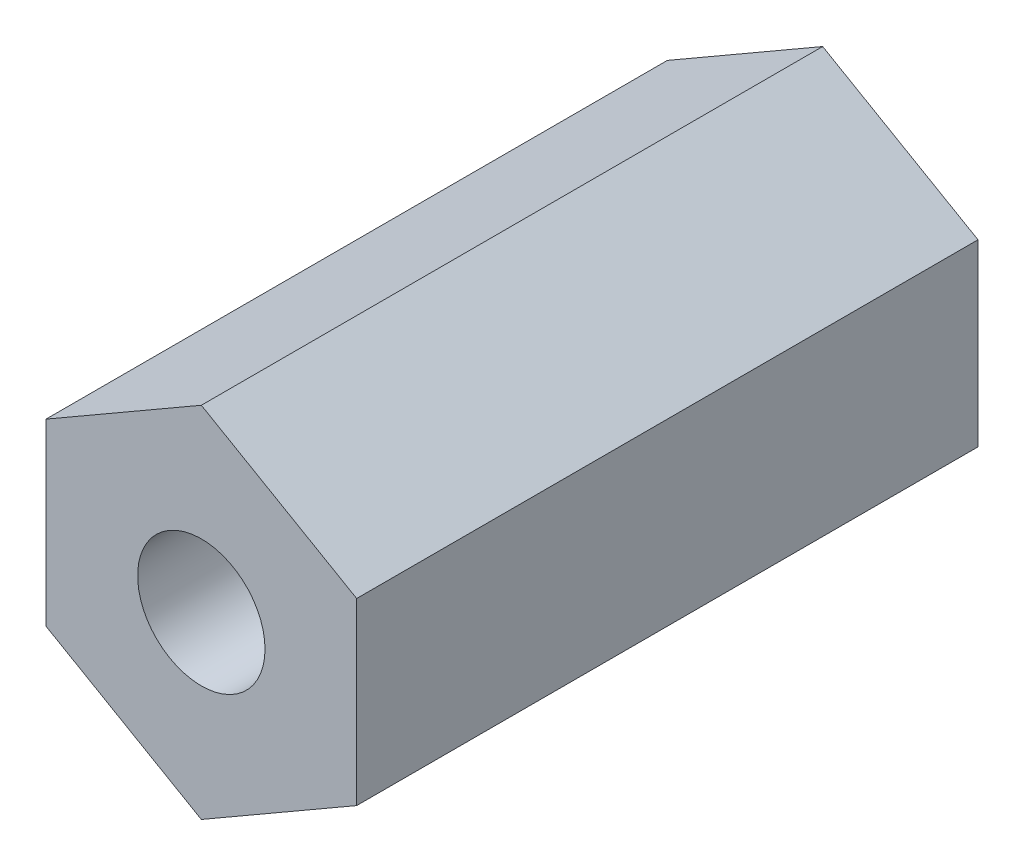
ISO-10303-21;
HEADER;
FILE_DESCRIPTION(('STEP AP214'),'2;1');
FILE_NAME('part.step','',(''),(''),'','','');
FILE_SCHEMA(('AUTOMOTIVE_DESIGN { 1 0 10303 214 1 1 1 1 }'));
ENDSEC;
DATA;
#1=APPLICATION_CONTEXT('core data for automotive mechanical design processes');
#2=APPLICATION_PROTOCOL_DEFINITION('international standard','automotive_design',2000,#1);
#3=PRODUCT_CONTEXT('',#1,'mechanical');
#4=PRODUCT('Part','Part','',(#3));
#5=PRODUCT_RELATED_PRODUCT_CATEGORY('part','',(#4));
#6=PRODUCT_DEFINITION_FORMATION('','',#4);
#7=PRODUCT_DEFINITION_CONTEXT('part definition',#1,'design');
#8=PRODUCT_DEFINITION('design','',#6,#7);
#9=PRODUCT_DEFINITION_SHAPE('','',#8);
#10=(LENGTH_UNIT() NAMED_UNIT(*) SI_UNIT(.MILLI.,.METRE.));
#11=(NAMED_UNIT(*) PLANE_ANGLE_UNIT() SI_UNIT($,.RADIAN.));
#12=(NAMED_UNIT(*) SI_UNIT($,.STERADIAN.) SOLID_ANGLE_UNIT());
#13=UNCERTAINTY_MEASURE_WITH_UNIT(LENGTH_MEASURE(1.E-05),#10,'distance_accuracy_value','');
#14=(GEOMETRIC_REPRESENTATION_CONTEXT(3) GLOBAL_UNCERTAINTY_ASSIGNED_CONTEXT((#13)) GLOBAL_UNIT_ASSIGNED_CONTEXT((#10,
#11,#12)) REPRESENTATION_CONTEXT('',''));
#15=CARTESIAN_POINT('',(0.,0.,0.));
#16=DIRECTION('',(0.,0.,1.));
#17=DIRECTION('',(1.,0.,0.));
#18=AXIS2_PLACEMENT_3D('',#15,#16,#17);
#19=CARTESIAN_POINT('',(-2.49999999999998,-1.44337567297409,10.));
#20=DIRECTION('',(0.499999999999995,0.866025403784442,0.));
#21=DIRECTION('',(-0.866025403784442,0.499999999999995,0.));
#22=AXIS2_PLACEMENT_3D('',#19,#20,#21);
#23=PLANE('',#22);
#24=DIRECTION('',(0.866025403784441,-0.499999999999995,0.));
#25=VECTOR('',#24,1.);
#26=CARTESIAN_POINT('',(-2.49999999999998,-1.44337567297409,0.));
#27=LINE('',#26,#25);
#28=CARTESIAN_POINT('',(-2.49999999999998,-1.44337567297409,0.));
#29=VERTEX_POINT('',#28);
#30=CARTESIAN_POINT('',(0.,-2.88675134594813,0.));
#31=VERTEX_POINT('',#30);
#32=EDGE_CURVE('E122',#29,#31,#27,.T.);
#33=ORIENTED_EDGE('',*,*,#32,.T.);
#34=DIRECTION('',(0.,0.,-1.));
#35=VECTOR('',#34,1.);
#36=CARTESIAN_POINT('',(0.,-2.88675134594813,10.));
#37=LINE('',#36,#35);
#38=CARTESIAN_POINT('',(0.,-2.88675134594813,10.));
#39=VERTEX_POINT('',#38);
#40=EDGE_CURVE('E11',#39,#31,#37,.T.);
#41=ORIENTED_EDGE('',*,*,#40,.F.);
#42=DIRECTION('',(0.866025403784441,-0.499999999999995,0.));
#43=VECTOR('',#42,1.);
#44=CARTESIAN_POINT('',(-2.49999999999998,-1.44337567297409,10.));
#45=LINE('',#44,#43);
#46=CARTESIAN_POINT('',(-2.49999999999998,-1.44337567297409,10.));
#47=VERTEX_POINT('',#46);
#48=EDGE_CURVE('E132',#47,#39,#45,.T.);
#49=ORIENTED_EDGE('',*,*,#48,.F.);
#50=DIRECTION('',(0.,0.,-1.));
#51=VECTOR('',#50,1.);
#52=CARTESIAN_POINT('',(-2.49999999999998,-1.44337567297409,10.));
#53=LINE('',#52,#51);
#54=EDGE_CURVE('E117',#47,#29,#53,.T.);
#55=ORIENTED_EDGE('',*,*,#54,.T.);
#56=EDGE_LOOP('',(#33,#41,#49,#55));
#57=FACE_BOUND('',#56,.T.);
#58=ADVANCED_FACE('F39',(#57),#23,.F.);
#59=CARTESIAN_POINT('',(0.,-2.88675134594813,10.));
#60=DIRECTION('',(-0.500000000000001,0.866025403784438,0.));
#61=DIRECTION('',(-0.866025403784438,-0.500000000000001,0.));
#62=AXIS2_PLACEMENT_3D('',#59,#60,#61);
#63=PLANE('',#62);
#64=DIRECTION('',(0.866025403784438,0.500000000000001,0.));
#65=VECTOR('',#64,1.);
#66=CARTESIAN_POINT('',(0.,-2.88675134594813,0.));
#67=LINE('',#66,#65);
#68=CARTESIAN_POINT('',(2.5,-1.44337567297406,0.));
#69=VERTEX_POINT('',#68);
#70=EDGE_CURVE('E127',#31,#69,#67,.T.);
#71=ORIENTED_EDGE('',*,*,#70,.T.);
#72=DIRECTION('',(0.,0.,-1.));
#73=VECTOR('',#72,1.);
#74=CARTESIAN_POINT('',(2.5,-1.44337567297406,10.));
#75=LINE('',#74,#73);
#76=CARTESIAN_POINT('',(2.5,-1.44337567297406,10.));
#77=VERTEX_POINT('',#76);
#78=EDGE_CURVE('E50',#77,#69,#75,.T.);
#79=ORIENTED_EDGE('',*,*,#78,.F.);
#80=DIRECTION('',(0.866025403784438,0.500000000000001,0.));
#81=VECTOR('',#80,1.);
#82=CARTESIAN_POINT('',(0.,-2.88675134594813,10.));
#83=LINE('',#82,#81);
#84=EDGE_CURVE('E95',#39,#77,#83,.T.);
#85=ORIENTED_EDGE('',*,*,#84,.F.);
#86=ORIENTED_EDGE('',*,*,#40,.T.);
#87=EDGE_LOOP('',(#71,#79,#85,#86));
#88=FACE_BOUND('',#87,.T.);
#89=ADVANCED_FACE('F157',(#88),#63,.F.);
#90=CARTESIAN_POINT('',(2.5,-1.44337567297406,10.));
#91=DIRECTION('',(-1.,0.,0.));
#92=DIRECTION('',(0.,-1.,0.));
#93=AXIS2_PLACEMENT_3D('',#90,#91,#92);
#94=PLANE('',#93);
#95=DIRECTION('',(0.,1.,0.));
#96=VECTOR('',#95,1.);
#97=CARTESIAN_POINT('',(2.5,-1.44337567297406,0.));
#98=LINE('',#97,#96);
#99=CARTESIAN_POINT('',(2.49999999999999,1.44337567297408,0.));
#100=VERTEX_POINT('',#99);
#101=EDGE_CURVE('E129',#69,#100,#98,.T.);
#102=ORIENTED_EDGE('',*,*,#101,.T.);
#103=DIRECTION('',(0.,0.,-1.));
#104=VECTOR('',#103,1.);
#105=CARTESIAN_POINT('',(2.49999999999999,1.44337567297408,10.));
#106=LINE('',#105,#104);
#107=CARTESIAN_POINT('',(2.49999999999999,1.44337567297408,10.));
#108=VERTEX_POINT('',#107);
#109=EDGE_CURVE('E111',#108,#100,#106,.T.);
#110=ORIENTED_EDGE('',*,*,#109,.F.);
#111=DIRECTION('',(0.,1.,0.));
#112=VECTOR('',#111,1.);
#113=CARTESIAN_POINT('',(2.5,-1.44337567297406,10.));
#114=LINE('',#113,#112);
#115=EDGE_CURVE('E104',#77,#108,#114,.T.);
#116=ORIENTED_EDGE('',*,*,#115,.F.);
#117=ORIENTED_EDGE('',*,*,#78,.T.);
#118=EDGE_LOOP('',(#102,#110,#116,#117));
#119=FACE_BOUND('',#118,.T.);
#120=ADVANCED_FACE('F139',(#119),#94,.F.);
#121=CARTESIAN_POINT('',(2.49999999999999,1.44337567297408,10.));
#122=DIRECTION('',(-0.499999999999995,-0.866025403784442,0.));
#123=DIRECTION('',(0.866025403784442,-0.499999999999995,0.));
#124=AXIS2_PLACEMENT_3D('',#121,#122,#123);
#125=PLANE('',#124);
#126=DIRECTION('',(-0.866025403784442,0.499999999999995,0.));
#127=VECTOR('',#126,1.);
#128=CARTESIAN_POINT('',(2.49999999999999,1.44337567297408,0.));
#129=LINE('',#128,#127);
#130=CARTESIAN_POINT('',(0.,2.88675134594813,0.));
#131=VERTEX_POINT('',#130);
#132=EDGE_CURVE('E114',#100,#131,#129,.T.);
#133=ORIENTED_EDGE('',*,*,#132,.T.);
#134=DIRECTION('',(0.,0.,-1.));
#135=VECTOR('',#134,1.);
#136=CARTESIAN_POINT('',(0.,2.88675134594813,10.));
#137=LINE('',#136,#135);
#138=CARTESIAN_POINT('',(0.,2.88675134594813,10.));
#139=VERTEX_POINT('',#138);
#140=EDGE_CURVE('E109',#139,#131,#137,.T.);
#141=ORIENTED_EDGE('',*,*,#140,.F.);
#142=DIRECTION('',(-0.866025403784442,0.499999999999995,0.));
#143=VECTOR('',#142,1.);
#144=CARTESIAN_POINT('',(2.49999999999999,1.44337567297408,10.));
#145=LINE('',#144,#143);
#146=EDGE_CURVE('E97',#108,#139,#145,.T.);
#147=ORIENTED_EDGE('',*,*,#146,.F.);
#148=ORIENTED_EDGE('',*,*,#109,.T.);
#149=EDGE_LOOP('',(#133,#141,#147,#148));
#150=FACE_BOUND('',#149,.T.);
#151=ADVANCED_FACE('F112',(#150),#125,.F.);
#152=CARTESIAN_POINT('',(0.,2.88675134594813,10.));
#153=DIRECTION('',(0.500000000000007,-0.866025403784435,0.));
#154=DIRECTION('',(0.866025403784435,0.500000000000007,0.));
#155=AXIS2_PLACEMENT_3D('',#152,#153,#154);
#156=PLANE('',#155);
#157=DIRECTION('',(-0.866025403784434,-0.500000000000007,0.));
#158=VECTOR('',#157,1.);
#159=CARTESIAN_POINT('',(0.,2.88675134594813,0.));
#160=LINE('',#159,#158);
#161=CARTESIAN_POINT('',(-2.50000000000001,1.44337567297404,0.));
#162=VERTEX_POINT('',#161);
#163=EDGE_CURVE('E76',#131,#162,#160,.T.);
#164=ORIENTED_EDGE('',*,*,#163,.T.);
#165=DIRECTION('',(0.,0.,-1.));
#166=VECTOR('',#165,1.);
#167=CARTESIAN_POINT('',(-2.50000000000001,1.44337567297404,10.));
#168=LINE('',#167,#166);
#169=CARTESIAN_POINT('',(-2.50000000000001,1.44337567297404,10.));
#170=VERTEX_POINT('',#169);
#171=EDGE_CURVE('E113',#170,#162,#168,.T.);
#172=ORIENTED_EDGE('',*,*,#171,.F.);
#173=DIRECTION('',(-0.866025403784434,-0.500000000000007,0.));
#174=VECTOR('',#173,1.);
#175=CARTESIAN_POINT('',(0.,2.88675134594813,10.));
#176=LINE('',#175,#174);
#177=EDGE_CURVE('E103',#139,#170,#176,.T.);
#178=ORIENTED_EDGE('',*,*,#177,.F.);
#179=ORIENTED_EDGE('',*,*,#140,.T.);
#180=EDGE_LOOP('',(#164,#172,#178,#179));
#181=FACE_BOUND('',#180,.T.);
#182=ADVANCED_FACE('F120',(#181),#156,.F.);
#183=CARTESIAN_POINT('',(-2.50000000000001,1.44337567297404,10.));
#184=DIRECTION('',(1.,0.,0.));
#185=DIRECTION('',(0.,1.,0.));
#186=AXIS2_PLACEMENT_3D('',#183,#184,#185);
#187=PLANE('',#186);
#188=DIRECTION('',(0.,-1.,0.));
#189=VECTOR('',#188,1.);
#190=CARTESIAN_POINT('',(-2.50000000000001,1.44337567297404,0.));
#191=LINE('',#190,#189);
#192=EDGE_CURVE('E83',#162,#29,#191,.T.);
#193=ORIENTED_EDGE('',*,*,#192,.T.);
#194=ORIENTED_EDGE('',*,*,#54,.F.);
#195=DIRECTION('',(0.,-1.,0.));
#196=VECTOR('',#195,1.);
#197=CARTESIAN_POINT('',(-2.50000000000001,1.44337567297404,10.));
#198=LINE('',#197,#196);
#199=EDGE_CURVE('E54',#170,#47,#198,.T.);
#200=ORIENTED_EDGE('',*,*,#199,.F.);
#201=ORIENTED_EDGE('',*,*,#171,.T.);
#202=EDGE_LOOP('',(#193,#194,#200,#201));
#203=FACE_BOUND('',#202,.T.);
#204=ADVANCED_FACE('F150',(#203),#187,.F.);
#205=CARTESIAN_POINT('',(0.,0.,10.));
#206=DIRECTION('',(0.,0.,1.));
#207=DIRECTION('',(1.,0.,0.));
#208=AXIS2_PLACEMENT_3D('',#205,#206,#207);
#209=PLANE('',#208);
#210=CARTESIAN_POINT('',(0.,0.,10.));
#211=DIRECTION('',(0.,0.,1.));
#212=DIRECTION('',(1.,0.,0.));
#213=AXIS2_PLACEMENT_3D('',#210,#211,#212);
#214=CIRCLE('',#213,1.025);
#215=CARTESIAN_POINT('',(1.025,0.,10.));
#216=VERTEX_POINT('',#215);
#217=EDGE_CURVE('E130',#216,#216,#214,.T.);
#218=ORIENTED_EDGE('',*,*,#217,.F.);
#219=EDGE_LOOP('',(#218));
#220=FACE_BOUND('',#219,.T.);
#221=ORIENTED_EDGE('',*,*,#48,.T.);
#222=ORIENTED_EDGE('',*,*,#84,.T.);
#223=ORIENTED_EDGE('',*,*,#115,.T.);
#224=ORIENTED_EDGE('',*,*,#146,.T.);
#225=ORIENTED_EDGE('',*,*,#177,.T.);
#226=ORIENTED_EDGE('',*,*,#199,.T.);
#227=EDGE_LOOP('',(#221,#222,#223,#224,#225,#226));
#228=FACE_BOUND('',#227,.T.);
#229=ADVANCED_FACE('F101',(#220,#228),#209,.T.);
#230=CARTESIAN_POINT('',(0.,0.,0.));
#231=DIRECTION('',(0.,0.,1.));
#232=DIRECTION('',(1.,0.,0.));
#233=AXIS2_PLACEMENT_3D('',#230,#231,#232);
#234=PLANE('',#233);
#235=CARTESIAN_POINT('',(0.,0.,0.));
#236=DIRECTION('',(0.,0.,1.));
#237=DIRECTION('',(1.,0.,0.));
#238=AXIS2_PLACEMENT_3D('',#235,#236,#237);
#239=CIRCLE('',#238,1.025);
#240=CARTESIAN_POINT('',(1.025,0.,0.));
#241=VERTEX_POINT('',#240);
#242=EDGE_CURVE('E214',#241,#241,#239,.T.);
#243=ORIENTED_EDGE('',*,*,#242,.T.);
#244=EDGE_LOOP('',(#243));
#245=FACE_BOUND('',#244,.T.);
#246=ORIENTED_EDGE('',*,*,#32,.F.);
#247=ORIENTED_EDGE('',*,*,#192,.F.);
#248=ORIENTED_EDGE('',*,*,#163,.F.);
#249=ORIENTED_EDGE('',*,*,#132,.F.);
#250=ORIENTED_EDGE('',*,*,#101,.F.);
#251=ORIENTED_EDGE('',*,*,#70,.F.);
#252=EDGE_LOOP('',(#246,#247,#248,#249,#250,#251));
#253=FACE_BOUND('',#252,.T.);
#254=ADVANCED_FACE('F141',(#245,#253),#234,.F.);
#255=CARTESIAN_POINT('',(0.,0.,10.));
#256=DIRECTION('',(0.,0.,-1.));
#257=DIRECTION('',(-1.,0.,0.));
#258=AXIS2_PLACEMENT_3D('',#255,#256,#257);
#259=CYLINDRICAL_SURFACE('',#258,1.025);
#260=ORIENTED_EDGE('',*,*,#217,.T.);
#261=EDGE_LOOP('',(#260));
#262=FACE_BOUND('',#261,.T.);
#263=ORIENTED_EDGE('',*,*,#242,.F.);
#264=EDGE_LOOP('',(#263));
#265=FACE_BOUND('',#264,.T.);
#266=ADVANCED_FACE('F196',(#262,#265),#259,.F.);
#267=CLOSED_SHELL('',(#58,#89,#120,#151,#182,#204,#229,#254,#266));
#268=MANIFOLD_SOLID_BREP('B2',#267);
#269=ADVANCED_BREP_SHAPE_REPRESENTATION('',(#18,#268),#14);
#270=SHAPE_DEFINITION_REPRESENTATION(#9,#269);
ENDSEC;
END-ISO-10303-21;
